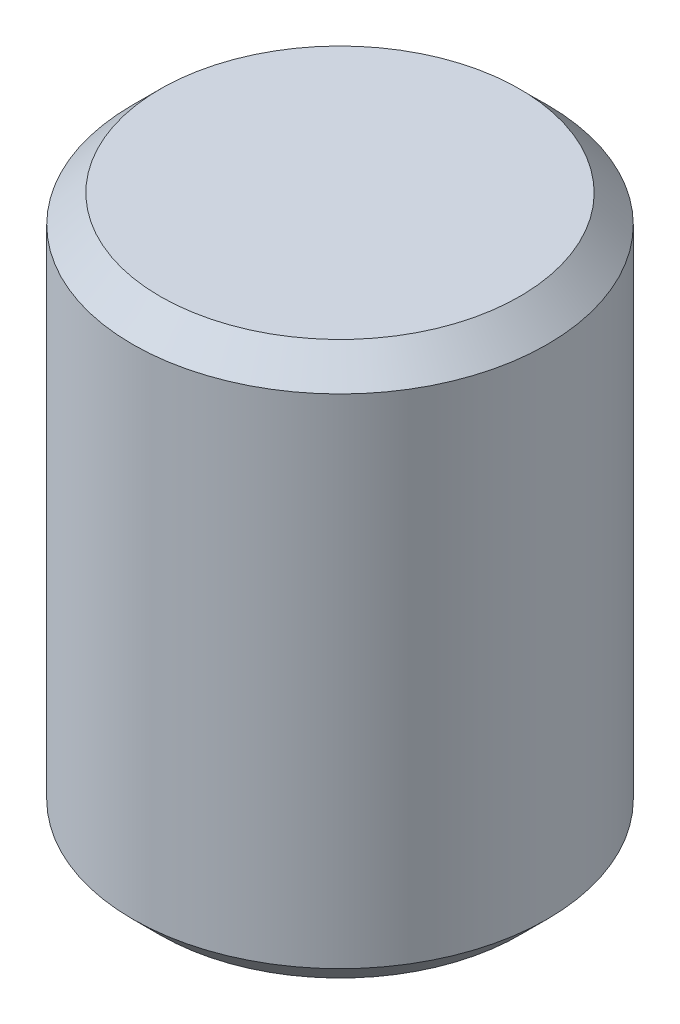
ISO-10303-21;
HEADER;
FILE_DESCRIPTION(('STEP AP214'),'2;1');
FILE_NAME('part.step','',(''),(''),'','','');
FILE_SCHEMA(('AUTOMOTIVE_DESIGN { 1 0 10303 214 1 1 1 1 }'));
ENDSEC;
DATA;
#1=APPLICATION_CONTEXT('core data for automotive mechanical design processes');
#2=APPLICATION_PROTOCOL_DEFINITION('international standard','automotive_design',2000,#1);
#3=PRODUCT_CONTEXT('',#1,'mechanical');
#4=PRODUCT('Part','Part','',(#3));
#5=PRODUCT_RELATED_PRODUCT_CATEGORY('part','',(#4));
#6=PRODUCT_DEFINITION_FORMATION('','',#4);
#7=PRODUCT_DEFINITION_CONTEXT('part definition',#1,'design');
#8=PRODUCT_DEFINITION('design','',#6,#7);
#9=PRODUCT_DEFINITION_SHAPE('','',#8);
#10=(LENGTH_UNIT() NAMED_UNIT(*) SI_UNIT(.MILLI.,.METRE.));
#11=(NAMED_UNIT(*) PLANE_ANGLE_UNIT() SI_UNIT($,.RADIAN.));
#12=(NAMED_UNIT(*) SI_UNIT($,.STERADIAN.) SOLID_ANGLE_UNIT());
#13=UNCERTAINTY_MEASURE_WITH_UNIT(LENGTH_MEASURE(1.E-05),#10,'distance_accuracy_value','');
#14=(GEOMETRIC_REPRESENTATION_CONTEXT(3) GLOBAL_UNCERTAINTY_ASSIGNED_CONTEXT((#13)) GLOBAL_UNIT_ASSIGNED_CONTEXT((#10,
#11,#12)) REPRESENTATION_CONTEXT('',''));
#15=CARTESIAN_POINT('',(0.,0.,0.));
#16=DIRECTION('',(0.,0.,1.));
#17=DIRECTION('',(1.,0.,0.));
#18=AXIS2_PLACEMENT_3D('',#15,#16,#17);
#19=CARTESIAN_POINT('',(0.,40.,0.));
#20=DIRECTION('',(0.,-1.,0.));
#21=DIRECTION('',(0.,0.,-1.));
#22=AXIS2_PLACEMENT_3D('',#19,#20,#21);
#23=CYLINDRICAL_SURFACE('',#22,15.);
#24=CARTESIAN_POINT('',(0.,2.,0.));
#25=DIRECTION('',(0.,1.,0.));
#26=DIRECTION('',(0.,0.,1.));
#27=AXIS2_PLACEMENT_3D('',#24,#25,#26);
#28=CIRCLE('',#27,15.);
#29=CARTESIAN_POINT('',(0.,2.,15.));
#30=VERTEX_POINT('',#29);
#31=EDGE_CURVE('E41',#30,#30,#28,.T.);
#32=ORIENTED_EDGE('',*,*,#31,.T.);
#33=EDGE_LOOP('',(#32));
#34=FACE_BOUND('',#33,.T.);
#35=CARTESIAN_POINT('',(0.,38.,0.));
#36=DIRECTION('',(0.,1.,0.));
#37=DIRECTION('',(0.,0.,1.));
#38=AXIS2_PLACEMENT_3D('',#35,#36,#37);
#39=CIRCLE('',#38,15.);
#40=CARTESIAN_POINT('',(0.,38.,15.));
#41=VERTEX_POINT('',#40);
#42=EDGE_CURVE('E45',#41,#41,#39,.F.);
#43=ORIENTED_EDGE('',*,*,#42,.T.);
#44=EDGE_LOOP('',(#43));
#45=FACE_BOUND('',#44,.T.);
#46=ADVANCED_FACE('F30',(#34,#45),#23,.T.);
#47=CARTESIAN_POINT('',(0.,40.,0.));
#48=DIRECTION('',(0.,1.,0.));
#49=DIRECTION('',(0.,0.,1.));
#50=AXIS2_PLACEMENT_3D('',#47,#48,#49);
#51=PLANE('',#50);
#52=CARTESIAN_POINT('',(0.,40.,0.));
#53=DIRECTION('',(0.,1.,0.));
#54=DIRECTION('',(0.,0.,1.));
#55=AXIS2_PLACEMENT_3D('',#52,#53,#54);
#56=CIRCLE('',#55,13.);
#57=CARTESIAN_POINT('',(0.,40.,13.));
#58=VERTEX_POINT('',#57);
#59=EDGE_CURVE('E10',#58,#58,#56,.T.);
#60=ORIENTED_EDGE('',*,*,#59,.T.);
#61=EDGE_LOOP('',(#60));
#62=FACE_BOUND('',#61,.T.);
#63=ADVANCED_FACE('F61',(#62),#51,.T.);
#64=CARTESIAN_POINT('',(0.,0.,0.));
#65=DIRECTION('',(0.,1.,0.));
#66=DIRECTION('',(0.,0.,1.));
#67=AXIS2_PLACEMENT_3D('',#64,#65,#66);
#68=PLANE('',#67);
#69=CARTESIAN_POINT('',(0.,0.,0.));
#70=DIRECTION('',(0.,1.,0.));
#71=DIRECTION('',(0.,0.,1.));
#72=AXIS2_PLACEMENT_3D('',#69,#70,#71);
#73=CIRCLE('',#72,13.);
#74=CARTESIAN_POINT('',(0.,0.,13.));
#75=VERTEX_POINT('',#74);
#76=EDGE_CURVE('E37',#75,#75,#73,.F.);
#77=ORIENTED_EDGE('',*,*,#76,.T.);
#78=EDGE_LOOP('',(#77));
#79=FACE_BOUND('',#78,.T.);
#80=ADVANCED_FACE('F58',(#79),#68,.F.);
#81=CARTESIAN_POINT('',(0.,2.,0.));
#82=DIRECTION('',(0.,1.,0.));
#83=DIRECTION('',(0.,0.,1.));
#84=AXIS2_PLACEMENT_3D('',#81,#82,#83);
#85=CONICAL_SURFACE('',#84,15.,0.78539816339745);
#86=ORIENTED_EDGE('',*,*,#76,.F.);
#87=EDGE_LOOP('',(#86));
#88=FACE_BOUND('',#87,.T.);
#89=ORIENTED_EDGE('',*,*,#31,.F.);
#90=EDGE_LOOP('',(#89));
#91=FACE_BOUND('',#90,.T.);
#92=ADVANCED_FACE('F54',(#88,#91),#85,.T.);
#93=CARTESIAN_POINT('',(0.,40.,0.));
#94=DIRECTION('',(0.,-1.,0.));
#95=DIRECTION('',(0.,0.,-1.));
#96=AXIS2_PLACEMENT_3D('',#93,#94,#95);
#97=CONICAL_SURFACE('',#96,13.,0.785398163397447);
#98=ORIENTED_EDGE('',*,*,#42,.F.);
#99=EDGE_LOOP('',(#98));
#100=FACE_BOUND('',#99,.T.);
#101=ORIENTED_EDGE('',*,*,#59,.F.);
#102=EDGE_LOOP('',(#101));
#103=FACE_BOUND('',#102,.T.);
#104=ADVANCED_FACE('F32',(#100,#103),#97,.T.);
#105=CLOSED_SHELL('',(#46,#63,#80,#92,#104));
#106=MANIFOLD_SOLID_BREP('B2',#105);
#107=ADVANCED_BREP_SHAPE_REPRESENTATION('',(#18,#106),#14);
#108=SHAPE_DEFINITION_REPRESENTATION(#9,#107);
ENDSEC;
END-ISO-10303-21;
